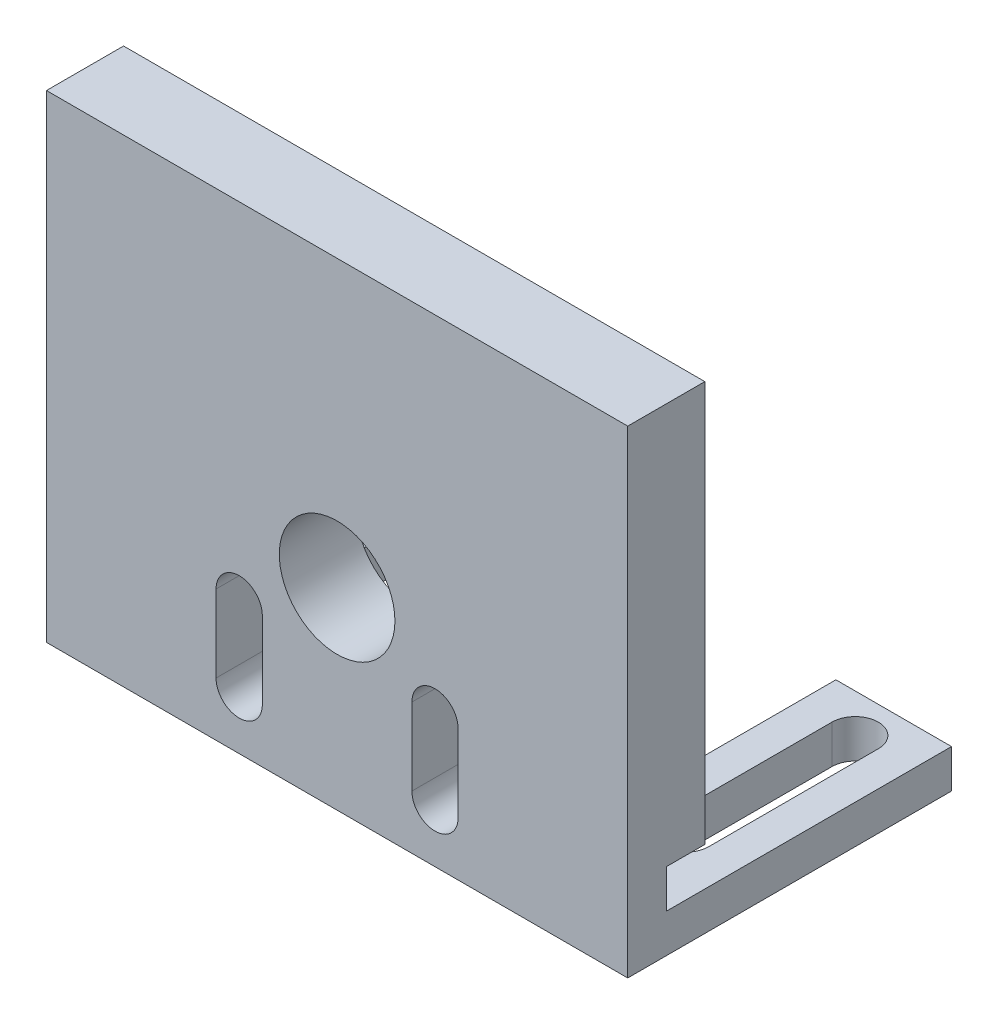
ISO-10303-21;
HEADER;
FILE_DESCRIPTION(('STEP AP214'),'2;1');
FILE_NAME('part.step','',(''),(''),'','','');
FILE_SCHEMA(('AUTOMOTIVE_DESIGN { 1 0 10303 214 1 1 1 1 }'));
ENDSEC;
DATA;
#1=APPLICATION_CONTEXT('core data for automotive mechanical design processes');
#2=APPLICATION_PROTOCOL_DEFINITION('international standard','automotive_design',2000,#1);
#3=PRODUCT_CONTEXT('',#1,'mechanical');
#4=PRODUCT('Part','Part','',(#3));
#5=PRODUCT_RELATED_PRODUCT_CATEGORY('part','',(#4));
#6=PRODUCT_DEFINITION_FORMATION('','',#4);
#7=PRODUCT_DEFINITION_CONTEXT('part definition',#1,'design');
#8=PRODUCT_DEFINITION('design','',#6,#7);
#9=PRODUCT_DEFINITION_SHAPE('','',#8);
#10=(LENGTH_UNIT() NAMED_UNIT(*) SI_UNIT(.MILLI.,.METRE.));
#11=(NAMED_UNIT(*) PLANE_ANGLE_UNIT() SI_UNIT($,.RADIAN.));
#12=(NAMED_UNIT(*) SI_UNIT($,.STERADIAN.) SOLID_ANGLE_UNIT());
#13=UNCERTAINTY_MEASURE_WITH_UNIT(LENGTH_MEASURE(1.E-05),#10,'distance_accuracy_value','');
#14=(GEOMETRIC_REPRESENTATION_CONTEXT(3) GLOBAL_UNCERTAINTY_ASSIGNED_CONTEXT((#13)) GLOBAL_UNIT_ASSIGNED_CONTEXT((#10,
#11,#12)) REPRESENTATION_CONTEXT('',''));
#15=CARTESIAN_POINT('',(0.,0.,0.));
#16=DIRECTION('',(0.,0.,1.));
#17=DIRECTION('',(1.,0.,0.));
#18=AXIS2_PLACEMENT_3D('',#15,#16,#17);
#19=CARTESIAN_POINT('',(0.,0.,0.));
#20=DIRECTION('',(0.,0.,-1.));
#21=DIRECTION('',(-1.,0.,0.));
#22=AXIS2_PLACEMENT_3D('',#19,#20,#21);
#23=PLANE('',#22);
#24=DIRECTION('',(0.,1.,0.));
#25=VECTOR('',#24,1.);
#26=CARTESIAN_POINT('',(15.7,17.,0.));
#27=LINE('',#26,#25);
#28=CARTESIAN_POINT('',(15.7,7.,0.));
#29=VERTEX_POINT('',#28);
#30=CARTESIAN_POINT('',(15.7,17.,0.));
#31=VERTEX_POINT('',#30);
#32=EDGE_CURVE('E468',#29,#31,#27,.T.);
#33=ORIENTED_EDGE('',*,*,#32,.T.);
#34=CARTESIAN_POINT('',(12.7,17.,0.));
#35=DIRECTION('',(0.,0.,1.));
#36=DIRECTION('',(-1.,0.,0.));
#37=AXIS2_PLACEMENT_3D('',#34,#35,#36);
#38=CIRCLE('',#37,3.);
#39=CARTESIAN_POINT('',(9.7,17.,0.));
#40=VERTEX_POINT('',#39);
#41=EDGE_CURVE('E460',#31,#40,#38,.T.);
#42=ORIENTED_EDGE('',*,*,#41,.T.);
#43=DIRECTION('',(0.,-1.,0.));
#44=VECTOR('',#43,1.);
#45=CARTESIAN_POINT('',(9.7,17.,0.));
#46=LINE('',#45,#44);
#47=CARTESIAN_POINT('',(9.7,7.,0.));
#48=VERTEX_POINT('',#47);
#49=EDGE_CURVE('E481',#40,#48,#46,.T.);
#50=ORIENTED_EDGE('',*,*,#49,.T.);
#51=CARTESIAN_POINT('',(12.7,7.,0.));
#52=DIRECTION('',(0.,0.,1.));
#53=DIRECTION('',(-1.,0.,0.));
#54=AXIS2_PLACEMENT_3D('',#51,#52,#53);
#55=CIRCLE('',#54,3.);
#56=EDGE_CURVE('E485',#48,#29,#55,.T.);
#57=ORIENTED_EDGE('',*,*,#56,.T.);
#58=EDGE_LOOP('',(#33,#42,#50,#57));
#59=FACE_BOUND('',#58,.T.);
#60=DIRECTION('',(0.,1.,0.));
#61=VECTOR('',#60,1.);
#62=CARTESIAN_POINT('',(-9.7,17.,0.));
#63=LINE('',#62,#61);
#64=CARTESIAN_POINT('',(-9.7,7.,0.));
#65=VERTEX_POINT('',#64);
#66=CARTESIAN_POINT('',(-9.7,17.,0.));
#67=VERTEX_POINT('',#66);
#68=EDGE_CURVE('E509',#65,#67,#63,.T.);
#69=ORIENTED_EDGE('',*,*,#68,.T.);
#70=CARTESIAN_POINT('',(-12.7,17.,0.));
#71=DIRECTION('',(0.,0.,1.));
#72=DIRECTION('',(1.,0.,0.));
#73=AXIS2_PLACEMENT_3D('',#70,#71,#72);
#74=CIRCLE('',#73,3.);
#75=CARTESIAN_POINT('',(-15.7,17.,0.));
#76=VERTEX_POINT('',#75);
#77=EDGE_CURVE('E504',#67,#76,#74,.T.);
#78=ORIENTED_EDGE('',*,*,#77,.T.);
#79=DIRECTION('',(0.,-1.,0.));
#80=VECTOR('',#79,1.);
#81=CARTESIAN_POINT('',(-15.7,17.,0.));
#82=LINE('',#81,#80);
#83=CARTESIAN_POINT('',(-15.7,6.99999999999999,0.));
#84=VERTEX_POINT('',#83);
#85=EDGE_CURVE('E523',#76,#84,#82,.T.);
#86=ORIENTED_EDGE('',*,*,#85,.T.);
#87=CARTESIAN_POINT('',(-12.7,7.,0.));
#88=DIRECTION('',(0.,0.,1.));
#89=DIRECTION('',(1.,0.,0.));
#90=AXIS2_PLACEMENT_3D('',#87,#88,#89);
#91=CIRCLE('',#90,3.);
#92=EDGE_CURVE('E527',#84,#65,#91,.T.);
#93=ORIENTED_EDGE('',*,*,#92,.T.);
#94=EDGE_LOOP('',(#69,#78,#86,#93));
#95=FACE_BOUND('',#94,.T.);
#96=CARTESIAN_POINT('',(0.,25.,0.));
#97=DIRECTION('',(0.,0.,1.));
#98=DIRECTION('',(1.,0.,0.));
#99=AXIS2_PLACEMENT_3D('',#96,#97,#98);
#100=CIRCLE('',#99,7.5);
#101=CARTESIAN_POINT('',(7.5,25.,0.));
#102=VERTEX_POINT('',#101);
#103=EDGE_CURVE('E455',#102,#102,#100,.T.);
#104=ORIENTED_EDGE('',*,*,#103,.T.);
#105=EDGE_LOOP('',(#104));
#106=FACE_BOUND('',#105,.T.);
#107=DIRECTION('',(0.,-1.,0.));
#108=VECTOR('',#107,1.);
#109=CARTESIAN_POINT('',(-22.7,5.,0.));
#110=LINE('',#109,#108);
#111=CARTESIAN_POINT('',(-22.7,5.,0.));
#112=VERTEX_POINT('',#111);
#113=CARTESIAN_POINT('',(-22.7,0.,0.));
#114=VERTEX_POINT('',#113);
#115=EDGE_CURVE('E452',#112,#114,#110,.T.);
#116=ORIENTED_EDGE('',*,*,#115,.F.);
#117=DIRECTION('',(0.,1.,0.));
#118=VECTOR('',#117,1.);
#119=CARTESIAN_POINT('',(-22.7,0.,0.));
#120=LINE('',#119,#118);
#121=CARTESIAN_POINT('',(-22.7,10.,0.));
#122=VERTEX_POINT('',#121);
#123=EDGE_CURVE('E274',#112,#122,#120,.T.);
#124=ORIENTED_EDGE('',*,*,#123,.T.);
#125=DIRECTION('',(1.,0.,0.));
#126=VECTOR('',#125,1.);
#127=CARTESIAN_POINT('',(0.,10.,0.));
#128=LINE('',#127,#126);
#129=CARTESIAN_POINT('',(-37.7,10.,0.));
#130=VERTEX_POINT('',#129);
#131=EDGE_CURVE('E270',#130,#122,#128,.T.);
#132=ORIENTED_EDGE('',*,*,#131,.F.);
#133=DIRECTION('',(0.,-1.,0.));
#134=VECTOR('',#133,1.);
#135=CARTESIAN_POINT('',(-37.7,0.,0.));
#136=LINE('',#135,#134);
#137=CARTESIAN_POINT('',(-37.7,62.,0.));
#138=VERTEX_POINT('',#137);
#139=EDGE_CURVE('E547',#138,#130,#136,.T.);
#140=ORIENTED_EDGE('',*,*,#139,.F.);
#141=DIRECTION('',(-1.,0.,0.));
#142=VECTOR('',#141,1.);
#143=CARTESIAN_POINT('',(-37.7,62.,0.));
#144=LINE('',#143,#142);
#145=CARTESIAN_POINT('',(37.7,62.,0.));
#146=VERTEX_POINT('',#145);
#147=EDGE_CURVE('E553',#146,#138,#144,.T.);
#148=ORIENTED_EDGE('',*,*,#147,.F.);
#149=DIRECTION('',(0.,1.,0.));
#150=VECTOR('',#149,1.);
#151=CARTESIAN_POINT('',(37.7,0.,0.));
#152=LINE('',#151,#150);
#153=CARTESIAN_POINT('',(37.7,10.,0.));
#154=VERTEX_POINT('',#153);
#155=EDGE_CURVE('E568',#154,#146,#152,.T.);
#156=ORIENTED_EDGE('',*,*,#155,.F.);
#157=DIRECTION('',(-1.,0.,0.));
#158=VECTOR('',#157,1.);
#159=CARTESIAN_POINT('',(0.,10.,0.));
#160=LINE('',#159,#158);
#161=CARTESIAN_POINT('',(22.7,10.,0.));
#162=VERTEX_POINT('',#161);
#163=EDGE_CURVE('E305',#154,#162,#160,.T.);
#164=ORIENTED_EDGE('',*,*,#163,.T.);
#165=DIRECTION('',(0.,1.,0.));
#166=VECTOR('',#165,1.);
#167=CARTESIAN_POINT('',(22.7,0.,0.));
#168=LINE('',#167,#166);
#169=CARTESIAN_POINT('',(22.7,5.,0.));
#170=VERTEX_POINT('',#169);
#171=EDGE_CURVE('E293',#170,#162,#168,.T.);
#172=ORIENTED_EDGE('',*,*,#171,.F.);
#173=DIRECTION('',(0.,-1.,0.));
#174=VECTOR('',#173,1.);
#175=CARTESIAN_POINT('',(22.7,5.,0.));
#176=LINE('',#175,#174);
#177=CARTESIAN_POINT('',(22.7,0.,0.));
#178=VERTEX_POINT('',#177);
#179=EDGE_CURVE('E324',#170,#178,#176,.T.);
#180=ORIENTED_EDGE('',*,*,#179,.T.);
#181=DIRECTION('',(1.,0.,0.));
#182=VECTOR('',#181,1.);
#183=CARTESIAN_POINT('',(-37.7,0.,0.));
#184=LINE('',#183,#182);
#185=EDGE_CURVE('E61',#114,#178,#184,.T.);
#186=ORIENTED_EDGE('',*,*,#185,.F.);
#187=EDGE_LOOP('',(#116,#124,#132,#140,#148,#156,#164,#172,#180,#186));
#188=FACE_BOUND('',#187,.T.);
#189=ADVANCED_FACE('F45',(#59,#95,#106,#188),#23,.T.);
#190=CARTESIAN_POINT('',(-37.7,0.,10.));
#191=DIRECTION('',(1.,0.,0.));
#192=DIRECTION('',(0.,1.,0.));
#193=AXIS2_PLACEMENT_3D('',#190,#191,#192);
#194=PLANE('',#193);
#195=DIRECTION('',(0.,1.,0.));
#196=VECTOR('',#195,1.);
#197=CARTESIAN_POINT('',(-37.7,0.,5.));
#198=LINE('',#197,#196);
#199=CARTESIAN_POINT('',(-37.7,5.,5.));
#200=VERTEX_POINT('',#199);
#201=CARTESIAN_POINT('',(-37.7,10.,5.));
#202=VERTEX_POINT('',#201);
#203=EDGE_CURVE('E970',#200,#202,#198,.T.);
#204=ORIENTED_EDGE('',*,*,#203,.F.);
#205=DIRECTION('',(0.,0.,1.));
#206=VECTOR('',#205,1.);
#207=CARTESIAN_POINT('',(-37.7,5.,0.));
#208=LINE('',#207,#206);
#209=CARTESIAN_POINT('',(-37.7,5.,-32.));
#210=VERTEX_POINT('',#209);
#211=EDGE_CURVE('E268',#210,#200,#208,.T.);
#212=ORIENTED_EDGE('',*,*,#211,.F.);
#213=DIRECTION('',(0.,-1.,0.));
#214=VECTOR('',#213,1.);
#215=CARTESIAN_POINT('',(-37.7,5.,-32.));
#216=LINE('',#215,#214);
#217=CARTESIAN_POINT('',(-37.7,0.,-32.));
#218=VERTEX_POINT('',#217);
#219=EDGE_CURVE('E439',#210,#218,#216,.T.);
#220=ORIENTED_EDGE('',*,*,#219,.T.);
#221=DIRECTION('',(0.,0.,-1.));
#222=VECTOR('',#221,1.);
#223=CARTESIAN_POINT('',(-37.7,0.,10.));
#224=LINE('',#223,#222);
#225=CARTESIAN_POINT('',(-37.7,0.,10.));
#226=VERTEX_POINT('',#225);
#227=EDGE_CURVE('E11',#226,#218,#224,.T.);
#228=ORIENTED_EDGE('',*,*,#227,.F.);
#229=DIRECTION('',(0.,-1.,0.));
#230=VECTOR('',#229,1.);
#231=CARTESIAN_POINT('',(-37.7,0.,10.));
#232=LINE('',#231,#230);
#233=CARTESIAN_POINT('',(-37.7,62.,10.));
#234=VERTEX_POINT('',#233);
#235=EDGE_CURVE('E548',#234,#226,#232,.T.);
#236=ORIENTED_EDGE('',*,*,#235,.F.);
#237=DIRECTION('',(0.,0.,-1.));
#238=VECTOR('',#237,1.);
#239=CARTESIAN_POINT('',(-37.7,62.,10.));
#240=LINE('',#239,#238);
#241=EDGE_CURVE('E562',#234,#138,#240,.T.);
#242=ORIENTED_EDGE('',*,*,#241,.T.);
#243=ORIENTED_EDGE('',*,*,#139,.T.);
#244=DIRECTION('',(0.,0.,-1.));
#245=VECTOR('',#244,1.);
#246=CARTESIAN_POINT('',(-37.7,10.,5.));
#247=LINE('',#246,#245);
#248=EDGE_CURVE('E284',#202,#130,#247,.T.);
#249=ORIENTED_EDGE('',*,*,#248,.F.);
#250=EDGE_LOOP('',(#204,#212,#220,#228,#236,#242,#243,#249));
#251=FACE_BOUND('',#250,.T.);
#252=ADVANCED_FACE('F47',(#251),#194,.F.);
#253=CARTESIAN_POINT('',(0.,0.,10.));
#254=DIRECTION('',(0.,0.,-1.));
#255=DIRECTION('',(-1.,0.,0.));
#256=AXIS2_PLACEMENT_3D('',#253,#254,#255);
#257=PLANE('',#256);
#258=CARTESIAN_POINT('',(-12.7,17.,10.));
#259=DIRECTION('',(0.,0.,1.));
#260=DIRECTION('',(1.,0.,0.));
#261=AXIS2_PLACEMENT_3D('',#258,#259,#260);
#262=CIRCLE('',#261,3.);
#263=CARTESIAN_POINT('',(-9.7,17.,10.));
#264=VERTEX_POINT('',#263);
#265=CARTESIAN_POINT('',(-15.7,17.,10.));
#266=VERTEX_POINT('',#265);
#267=EDGE_CURVE('E505',#264,#266,#262,.T.);
#268=ORIENTED_EDGE('',*,*,#267,.F.);
#269=DIRECTION('',(0.,1.,0.));
#270=VECTOR('',#269,1.);
#271=CARTESIAN_POINT('',(-9.7,17.,10.));
#272=LINE('',#271,#270);
#273=CARTESIAN_POINT('',(-9.7,7.,10.));
#274=VERTEX_POINT('',#273);
#275=EDGE_CURVE('E516',#274,#264,#272,.T.);
#276=ORIENTED_EDGE('',*,*,#275,.F.);
#277=CARTESIAN_POINT('',(-12.7,7.,10.));
#278=DIRECTION('',(0.,0.,1.));
#279=DIRECTION('',(1.,0.,0.));
#280=AXIS2_PLACEMENT_3D('',#277,#278,#279);
#281=CIRCLE('',#280,3.);
#282=CARTESIAN_POINT('',(-15.7,6.99999999999999,10.));
#283=VERTEX_POINT('',#282);
#284=EDGE_CURVE('E512',#283,#274,#281,.T.);
#285=ORIENTED_EDGE('',*,*,#284,.F.);
#286=DIRECTION('',(0.,-1.,0.));
#287=VECTOR('',#286,1.);
#288=CARTESIAN_POINT('',(-15.7,17.,10.));
#289=LINE('',#288,#287);
#290=EDGE_CURVE('E508',#266,#283,#289,.T.);
#291=ORIENTED_EDGE('',*,*,#290,.F.);
#292=EDGE_LOOP('',(#268,#276,#285,#291));
#293=FACE_BOUND('',#292,.T.);
#294=ORIENTED_EDGE('',*,*,#235,.T.);
#295=DIRECTION('',(1.,0.,0.));
#296=VECTOR('',#295,1.);
#297=CARTESIAN_POINT('',(-37.7,0.,10.));
#298=LINE('',#297,#296);
#299=CARTESIAN_POINT('',(37.7,0.,10.));
#300=VERTEX_POINT('',#299);
#301=EDGE_CURVE('E552',#226,#300,#298,.T.);
#302=ORIENTED_EDGE('',*,*,#301,.T.);
#303=DIRECTION('',(0.,1.,0.));
#304=VECTOR('',#303,1.);
#305=CARTESIAN_POINT('',(37.7,0.,10.));
#306=LINE('',#305,#304);
#307=CARTESIAN_POINT('',(37.7,62.,10.));
#308=VERTEX_POINT('',#307);
#309=EDGE_CURVE('E556',#300,#308,#306,.T.);
#310=ORIENTED_EDGE('',*,*,#309,.T.);
#311=DIRECTION('',(-1.,0.,0.));
#312=VECTOR('',#311,1.);
#313=CARTESIAN_POINT('',(-37.7,62.,10.));
#314=LINE('',#313,#312);
#315=EDGE_CURVE('E559',#308,#234,#314,.T.);
#316=ORIENTED_EDGE('',*,*,#315,.T.);
#317=EDGE_LOOP('',(#294,#302,#310,#316));
#318=FACE_BOUND('',#317,.T.);
#319=CARTESIAN_POINT('',(12.7,17.,10.));
#320=DIRECTION('',(0.,0.,1.));
#321=DIRECTION('',(-1.,0.,0.));
#322=AXIS2_PLACEMENT_3D('',#319,#320,#321);
#323=CIRCLE('',#322,3.);
#324=CARTESIAN_POINT('',(15.7,17.,10.));
#325=VERTEX_POINT('',#324);
#326=CARTESIAN_POINT('',(9.7,17.,10.));
#327=VERTEX_POINT('',#326);
#328=EDGE_CURVE('E464',#325,#327,#323,.T.);
#329=ORIENTED_EDGE('',*,*,#328,.F.);
#330=DIRECTION('',(0.,1.,0.));
#331=VECTOR('',#330,1.);
#332=CARTESIAN_POINT('',(15.7,17.,10.));
#333=LINE('',#332,#331);
#334=CARTESIAN_POINT('',(15.7,7.,10.));
#335=VERTEX_POINT('',#334);
#336=EDGE_CURVE('E474',#335,#325,#333,.T.);
#337=ORIENTED_EDGE('',*,*,#336,.F.);
#338=CARTESIAN_POINT('',(12.7,7.,10.));
#339=DIRECTION('',(0.,0.,1.));
#340=DIRECTION('',(-1.,0.,0.));
#341=AXIS2_PLACEMENT_3D('',#338,#339,#340);
#342=CIRCLE('',#341,3.);
#343=CARTESIAN_POINT('',(9.7,7.,10.));
#344=VERTEX_POINT('',#343);
#345=EDGE_CURVE('E471',#344,#335,#342,.T.);
#346=ORIENTED_EDGE('',*,*,#345,.F.);
#347=DIRECTION('',(0.,-1.,0.));
#348=VECTOR('',#347,1.);
#349=CARTESIAN_POINT('',(9.7,17.,10.));
#350=LINE('',#349,#348);
#351=EDGE_CURVE('E467',#327,#344,#350,.T.);
#352=ORIENTED_EDGE('',*,*,#351,.F.);
#353=EDGE_LOOP('',(#329,#337,#346,#352));
#354=FACE_BOUND('',#353,.T.);
#355=CARTESIAN_POINT('',(0.,25.,10.));
#356=DIRECTION('',(0.,0.,1.));
#357=DIRECTION('',(1.,0.,0.));
#358=AXIS2_PLACEMENT_3D('',#355,#356,#357);
#359=CIRCLE('',#358,7.5);
#360=CARTESIAN_POINT('',(7.5,25.,10.));
#361=VERTEX_POINT('',#360);
#362=EDGE_CURVE('E456',#361,#361,#359,.T.);
#363=ORIENTED_EDGE('',*,*,#362,.F.);
#364=EDGE_LOOP('',(#363));
#365=FACE_BOUND('',#364,.T.);
#366=ADVANCED_FACE('F632',(#293,#318,#354,#365),#257,.F.);
#367=CARTESIAN_POINT('',(-37.7,0.,10.));
#368=DIRECTION('',(0.,1.,0.));
#369=DIRECTION('',(-1.,0.,0.));
#370=AXIS2_PLACEMENT_3D('',#367,#368,#369);
#371=PLANE('',#370);
#372=ORIENTED_EDGE('',*,*,#227,.T.);
#373=DIRECTION('',(-1.,0.,0.));
#374=VECTOR('',#373,1.);
#375=CARTESIAN_POINT('',(-37.7,0.,-32.));
#376=LINE('',#375,#374);
#377=CARTESIAN_POINT('',(-22.7,0.,-32.));
#378=VERTEX_POINT('',#377);
#379=EDGE_CURVE('E433',#378,#218,#376,.T.);
#380=ORIENTED_EDGE('',*,*,#379,.F.);
#381=DIRECTION('',(0.,0.,-1.));
#382=VECTOR('',#381,1.);
#383=CARTESIAN_POINT('',(-22.7,0.,0.));
#384=LINE('',#383,#382);
#385=EDGE_CURVE('E429',#114,#378,#384,.T.);
#386=ORIENTED_EDGE('',*,*,#385,.F.);
#387=ORIENTED_EDGE('',*,*,#185,.T.);
#388=DIRECTION('',(0.,0.,1.));
#389=VECTOR('',#388,1.);
#390=CARTESIAN_POINT('',(22.7,0.,0.));
#391=LINE('',#390,#389);
#392=CARTESIAN_POINT('',(22.7,0.,-32.));
#393=VERTEX_POINT('',#392);
#394=EDGE_CURVE('E328',#393,#178,#391,.T.);
#395=ORIENTED_EDGE('',*,*,#394,.F.);
#396=DIRECTION('',(-1.,0.,0.));
#397=VECTOR('',#396,1.);
#398=CARTESIAN_POINT('',(37.7,0.,-32.));
#399=LINE('',#398,#397);
#400=CARTESIAN_POINT('',(37.7,0.,-32.));
#401=VERTEX_POINT('',#400);
#402=EDGE_CURVE('E331',#401,#393,#399,.T.);
#403=ORIENTED_EDGE('',*,*,#402,.F.);
#404=DIRECTION('',(0.,0.,-1.));
#405=VECTOR('',#404,1.);
#406=CARTESIAN_POINT('',(37.7,0.,10.));
#407=LINE('',#406,#405);
#408=EDGE_CURVE('E54',#300,#401,#407,.T.);
#409=ORIENTED_EDGE('',*,*,#408,.F.);
#410=ORIENTED_EDGE('',*,*,#301,.F.);
#411=EDGE_LOOP('',(#372,#380,#386,#387,#395,#403,#409,#410));
#412=FACE_BOUND('',#411,.T.);
#413=DIRECTION('',(0.,0.,-1.));
#414=VECTOR('',#413,1.);
#415=CARTESIAN_POINT('',(-27.2,0.,-27.));
#416=LINE('',#415,#414);
#417=CARTESIAN_POINT('',(-27.2,0.,-5.));
#418=VERTEX_POINT('',#417);
#419=CARTESIAN_POINT('',(-27.2,0.,-27.));
#420=VERTEX_POINT('',#419);
#421=EDGE_CURVE('E391',#418,#420,#416,.T.);
#422=ORIENTED_EDGE('',*,*,#421,.T.);
#423=CARTESIAN_POINT('',(-30.2,0.,-27.));
#424=DIRECTION('',(0.,1.,0.));
#425=DIRECTION('',(0.,0.,1.));
#426=AXIS2_PLACEMENT_3D('',#423,#424,#425);
#427=CIRCLE('',#426,2.99999999999999);
#428=CARTESIAN_POINT('',(-33.2,0.,-27.));
#429=VERTEX_POINT('',#428);
#430=EDGE_CURVE('E375',#420,#429,#427,.T.);
#431=ORIENTED_EDGE('',*,*,#430,.T.);
#432=DIRECTION('',(0.,0.,1.));
#433=VECTOR('',#432,1.);
#434=CARTESIAN_POINT('',(-33.2,0.,-27.));
#435=LINE('',#434,#433);
#436=CARTESIAN_POINT('',(-33.2,0.,-5.));
#437=VERTEX_POINT('',#436);
#438=EDGE_CURVE('E405',#429,#437,#435,.T.);
#439=ORIENTED_EDGE('',*,*,#438,.T.);
#440=CARTESIAN_POINT('',(-30.2,0.,-5.));
#441=DIRECTION('',(0.,1.,0.));
#442=DIRECTION('',(0.,0.,1.));
#443=AXIS2_PLACEMENT_3D('',#440,#441,#442);
#444=CIRCLE('',#443,3.);
#445=EDGE_CURVE('E409',#437,#418,#444,.T.);
#446=ORIENTED_EDGE('',*,*,#445,.T.);
#447=EDGE_LOOP('',(#422,#431,#439,#446));
#448=FACE_BOUND('',#447,.T.);
#449=DIRECTION('',(0.,0.,-1.));
#450=VECTOR('',#449,1.);
#451=CARTESIAN_POINT('',(33.2,0.,-27.));
#452=LINE('',#451,#450);
#453=CARTESIAN_POINT('',(33.2,0.,-5.));
#454=VERTEX_POINT('',#453);
#455=CARTESIAN_POINT('',(33.2,0.,-27.));
#456=VERTEX_POINT('',#455);
#457=EDGE_CURVE('E358',#454,#456,#452,.T.);
#458=ORIENTED_EDGE('',*,*,#457,.T.);
#459=CARTESIAN_POINT('',(30.2,0.,-27.));
#460=DIRECTION('',(0.,1.,0.));
#461=DIRECTION('',(0.,0.,-1.));
#462=AXIS2_PLACEMENT_3D('',#459,#460,#461);
#463=CIRCLE('',#462,3.);
#464=CARTESIAN_POINT('',(27.2,0.,-27.));
#465=VERTEX_POINT('',#464);
#466=EDGE_CURVE('E371',#456,#465,#463,.T.);
#467=ORIENTED_EDGE('',*,*,#466,.T.);
#468=DIRECTION('',(0.,0.,1.));
#469=VECTOR('',#468,1.);
#470=CARTESIAN_POINT('',(27.2,0.,-27.));
#471=LINE('',#470,#469);
#472=CARTESIAN_POINT('',(27.2,0.,-5.));
#473=VERTEX_POINT('',#472);
#474=EDGE_CURVE('E367',#465,#473,#471,.T.);
#475=ORIENTED_EDGE('',*,*,#474,.T.);
#476=CARTESIAN_POINT('',(30.2,0.,-5.));
#477=DIRECTION('',(0.,1.,0.));
#478=DIRECTION('',(0.,0.,-1.));
#479=AXIS2_PLACEMENT_3D('',#476,#477,#478);
#480=CIRCLE('',#479,3.);
#481=EDGE_CURVE('E362',#473,#454,#480,.T.);
#482=ORIENTED_EDGE('',*,*,#481,.T.);
#483=EDGE_LOOP('',(#458,#467,#475,#482));
#484=FACE_BOUND('',#483,.T.);
#485=ADVANCED_FACE('F593',(#412,#448,#484),#371,.F.);
#486=CARTESIAN_POINT('',(37.7,0.,10.));
#487=DIRECTION('',(-1.,0.,0.));
#488=DIRECTION('',(0.,-1.,0.));
#489=AXIS2_PLACEMENT_3D('',#486,#487,#488);
#490=PLANE('',#489);
#491=DIRECTION('',(0.,0.,-1.));
#492=VECTOR('',#491,1.);
#493=CARTESIAN_POINT('',(37.7,5.,0.));
#494=LINE('',#493,#492);
#495=CARTESIAN_POINT('',(37.7,5.,5.));
#496=VERTEX_POINT('',#495);
#497=CARTESIAN_POINT('',(37.7,5.,-32.));
#498=VERTEX_POINT('',#497);
#499=EDGE_CURVE('E332',#496,#498,#494,.T.);
#500=ORIENTED_EDGE('',*,*,#499,.F.);
#501=DIRECTION('',(0.,1.,0.));
#502=VECTOR('',#501,1.);
#503=CARTESIAN_POINT('',(37.7,0.,5.));
#504=LINE('',#503,#502);
#505=CARTESIAN_POINT('',(37.7,10.,5.));
#506=VERTEX_POINT('',#505);
#507=EDGE_CURVE('E292',#496,#506,#504,.T.);
#508=ORIENTED_EDGE('',*,*,#507,.T.);
#509=DIRECTION('',(0.,0.,-1.));
#510=VECTOR('',#509,1.);
#511=CARTESIAN_POINT('',(37.7,10.,5.));
#512=LINE('',#511,#510);
#513=EDGE_CURVE('E317',#506,#154,#512,.T.);
#514=ORIENTED_EDGE('',*,*,#513,.T.);
#515=ORIENTED_EDGE('',*,*,#155,.T.);
#516=DIRECTION('',(0.,0.,-1.));
#517=VECTOR('',#516,1.);
#518=CARTESIAN_POINT('',(37.7,62.,10.));
#519=LINE('',#518,#517);
#520=EDGE_CURVE('E576',#308,#146,#519,.T.);
#521=ORIENTED_EDGE('',*,*,#520,.F.);
#522=ORIENTED_EDGE('',*,*,#309,.F.);
#523=ORIENTED_EDGE('',*,*,#408,.T.);
#524=DIRECTION('',(0.,-1.,0.));
#525=VECTOR('',#524,1.);
#526=CARTESIAN_POINT('',(37.7,5.,-32.));
#527=LINE('',#526,#525);
#528=EDGE_CURVE('E276',#498,#401,#527,.T.);
#529=ORIENTED_EDGE('',*,*,#528,.F.);
#530=EDGE_LOOP('',(#500,#508,#514,#515,#521,#522,#523,#529));
#531=FACE_BOUND('',#530,.T.);
#532=ADVANCED_FACE('F584',(#531),#490,.F.);
#533=CARTESIAN_POINT('',(-37.7,62.,10.));
#534=DIRECTION('',(0.,-1.,0.));
#535=DIRECTION('',(1.,0.,0.));
#536=AXIS2_PLACEMENT_3D('',#533,#534,#535);
#537=PLANE('',#536);
#538=ORIENTED_EDGE('',*,*,#147,.T.);
#539=ORIENTED_EDGE('',*,*,#241,.F.);
#540=ORIENTED_EDGE('',*,*,#315,.F.);
#541=ORIENTED_EDGE('',*,*,#520,.T.);
#542=EDGE_LOOP('',(#538,#539,#540,#541));
#543=FACE_BOUND('',#542,.T.);
#544=ADVANCED_FACE('F638',(#543),#537,.F.);
#545=CARTESIAN_POINT('',(-12.7,17.,10.));
#546=DIRECTION('',(0.,0.,-1.));
#547=DIRECTION('',(-1.,0.,0.));
#548=AXIS2_PLACEMENT_3D('',#545,#546,#547);
#549=CYLINDRICAL_SURFACE('',#548,3.);
#550=ORIENTED_EDGE('',*,*,#77,.F.);
#551=DIRECTION('',(0.,0.,-1.));
#552=VECTOR('',#551,1.);
#553=CARTESIAN_POINT('',(-9.7,17.,10.));
#554=LINE('',#553,#552);
#555=EDGE_CURVE('E519',#264,#67,#554,.T.);
#556=ORIENTED_EDGE('',*,*,#555,.F.);
#557=ORIENTED_EDGE('',*,*,#267,.T.);
#558=DIRECTION('',(0.,0.,-1.));
#559=VECTOR('',#558,1.);
#560=CARTESIAN_POINT('',(-15.7,17.,10.));
#561=LINE('',#560,#559);
#562=EDGE_CURVE('E543',#266,#76,#561,.T.);
#563=ORIENTED_EDGE('',*,*,#562,.T.);
#564=EDGE_LOOP('',(#550,#556,#557,#563));
#565=FACE_BOUND('',#564,.T.);
#566=ADVANCED_FACE('F641',(#565),#549,.F.);
#567=CARTESIAN_POINT('',(-15.7,17.,10.));
#568=DIRECTION('',(1.,0.,0.));
#569=DIRECTION('',(0.,0.,-1.));
#570=AXIS2_PLACEMENT_3D('',#567,#568,#569);
#571=PLANE('',#570);
#572=ORIENTED_EDGE('',*,*,#85,.F.);
#573=ORIENTED_EDGE('',*,*,#562,.F.);
#574=ORIENTED_EDGE('',*,*,#290,.T.);
#575=DIRECTION('',(0.,0.,-1.));
#576=VECTOR('',#575,1.);
#577=CARTESIAN_POINT('',(-15.7,6.99999999999999,10.));
#578=LINE('',#577,#576);
#579=EDGE_CURVE('E540',#283,#84,#578,.T.);
#580=ORIENTED_EDGE('',*,*,#579,.T.);
#581=EDGE_LOOP('',(#572,#573,#574,#580));
#582=FACE_BOUND('',#581,.T.);
#583=ADVANCED_FACE('F701',(#582),#571,.T.);
#584=CARTESIAN_POINT('',(-12.7,7.,10.));
#585=DIRECTION('',(0.,0.,-1.));
#586=DIRECTION('',(-1.,0.,0.));
#587=AXIS2_PLACEMENT_3D('',#584,#585,#586);
#588=CYLINDRICAL_SURFACE('',#587,3.);
#589=ORIENTED_EDGE('',*,*,#92,.F.);
#590=ORIENTED_EDGE('',*,*,#579,.F.);
#591=ORIENTED_EDGE('',*,*,#284,.T.);
#592=DIRECTION('',(0.,0.,-1.));
#593=VECTOR('',#592,1.);
#594=CARTESIAN_POINT('',(-9.7,7.,10.));
#595=LINE('',#594,#593);
#596=EDGE_CURVE('E537',#274,#65,#595,.T.);
#597=ORIENTED_EDGE('',*,*,#596,.T.);
#598=EDGE_LOOP('',(#589,#590,#591,#597));
#599=FACE_BOUND('',#598,.T.);
#600=ADVANCED_FACE('F697',(#599),#588,.F.);
#601=CARTESIAN_POINT('',(-9.7,17.,10.));
#602=DIRECTION('',(-1.,0.,0.));
#603=DIRECTION('',(0.,0.,1.));
#604=AXIS2_PLACEMENT_3D('',#601,#602,#603);
#605=PLANE('',#604);
#606=ORIENTED_EDGE('',*,*,#68,.F.);
#607=ORIENTED_EDGE('',*,*,#596,.F.);
#608=ORIENTED_EDGE('',*,*,#275,.T.);
#609=ORIENTED_EDGE('',*,*,#555,.T.);
#610=EDGE_LOOP('',(#606,#607,#608,#609));
#611=FACE_BOUND('',#610,.T.);
#612=ADVANCED_FACE('F693',(#611),#605,.T.);
#613=CARTESIAN_POINT('',(12.7,17.,10.));
#614=DIRECTION('',(0.,0.,-1.));
#615=DIRECTION('',(-1.,0.,0.));
#616=AXIS2_PLACEMENT_3D('',#613,#614,#615);
#617=CYLINDRICAL_SURFACE('',#616,3.);
#618=ORIENTED_EDGE('',*,*,#41,.F.);
#619=DIRECTION('',(0.,0.,-1.));
#620=VECTOR('',#619,1.);
#621=CARTESIAN_POINT('',(15.7,17.,10.));
#622=LINE('',#621,#620);
#623=EDGE_CURVE('E477',#325,#31,#622,.T.);
#624=ORIENTED_EDGE('',*,*,#623,.F.);
#625=ORIENTED_EDGE('',*,*,#328,.T.);
#626=DIRECTION('',(0.,0.,-1.));
#627=VECTOR('',#626,1.);
#628=CARTESIAN_POINT('',(9.7,17.,10.));
#629=LINE('',#628,#627);
#630=EDGE_CURVE('E500',#327,#40,#629,.T.);
#631=ORIENTED_EDGE('',*,*,#630,.T.);
#632=EDGE_LOOP('',(#618,#624,#625,#631));
#633=FACE_BOUND('',#632,.T.);
#634=ADVANCED_FACE('F689',(#633),#617,.F.);
#635=CARTESIAN_POINT('',(9.7,17.,10.));
#636=DIRECTION('',(1.,0.,0.));
#637=DIRECTION('',(0.,0.,-1.));
#638=AXIS2_PLACEMENT_3D('',#635,#636,#637);
#639=PLANE('',#638);
#640=ORIENTED_EDGE('',*,*,#49,.F.);
#641=ORIENTED_EDGE('',*,*,#630,.F.);
#642=ORIENTED_EDGE('',*,*,#351,.T.);
#643=DIRECTION('',(0.,0.,-1.));
#644=VECTOR('',#643,1.);
#645=CARTESIAN_POINT('',(9.7,7.,10.));
#646=LINE('',#645,#644);
#647=EDGE_CURVE('E497',#344,#48,#646,.T.);
#648=ORIENTED_EDGE('',*,*,#647,.T.);
#649=EDGE_LOOP('',(#640,#641,#642,#648));
#650=FACE_BOUND('',#649,.T.);
#651=ADVANCED_FACE('F685',(#650),#639,.T.);
#652=CARTESIAN_POINT('',(12.7,7.,10.));
#653=DIRECTION('',(0.,0.,-1.));
#654=DIRECTION('',(-1.,0.,0.));
#655=AXIS2_PLACEMENT_3D('',#652,#653,#654);
#656=CYLINDRICAL_SURFACE('',#655,3.);
#657=ORIENTED_EDGE('',*,*,#56,.F.);
#658=ORIENTED_EDGE('',*,*,#647,.F.);
#659=ORIENTED_EDGE('',*,*,#345,.T.);
#660=DIRECTION('',(0.,0.,-1.));
#661=VECTOR('',#660,1.);
#662=CARTESIAN_POINT('',(15.7,7.,10.));
#663=LINE('',#662,#661);
#664=EDGE_CURVE('E69',#335,#29,#663,.T.);
#665=ORIENTED_EDGE('',*,*,#664,.T.);
#666=EDGE_LOOP('',(#657,#658,#659,#665));
#667=FACE_BOUND('',#666,.T.);
#668=ADVANCED_FACE('F678',(#667),#656,.F.);
#669=CARTESIAN_POINT('',(15.7,17.,10.));
#670=DIRECTION('',(-1.,0.,0.));
#671=DIRECTION('',(0.,0.,1.));
#672=AXIS2_PLACEMENT_3D('',#669,#670,#671);
#673=PLANE('',#672);
#674=ORIENTED_EDGE('',*,*,#32,.F.);
#675=ORIENTED_EDGE('',*,*,#664,.F.);
#676=ORIENTED_EDGE('',*,*,#336,.T.);
#677=ORIENTED_EDGE('',*,*,#623,.T.);
#678=EDGE_LOOP('',(#674,#675,#676,#677));
#679=FACE_BOUND('',#678,.T.);
#680=ADVANCED_FACE('F668',(#679),#673,.T.);
#681=CARTESIAN_POINT('',(0.,25.,10.));
#682=DIRECTION('',(0.,0.,-1.));
#683=DIRECTION('',(-1.,0.,0.));
#684=AXIS2_PLACEMENT_3D('',#681,#682,#683);
#685=CYLINDRICAL_SURFACE('',#684,7.5);
#686=ORIENTED_EDGE('',*,*,#362,.T.);
#687=EDGE_LOOP('',(#686));
#688=FACE_BOUND('',#687,.T.);
#689=ORIENTED_EDGE('',*,*,#103,.F.);
#690=EDGE_LOOP('',(#689));
#691=FACE_BOUND('',#690,.T.);
#692=ADVANCED_FACE('F666',(#688,#691),#685,.F.);
#693=CARTESIAN_POINT('',(0.,5.,0.));
#694=DIRECTION('',(0.,-1.,0.));
#695=DIRECTION('',(0.,0.,-1.));
#696=AXIS2_PLACEMENT_3D('',#693,#694,#695);
#697=PLANE('',#696);
#698=ORIENTED_EDGE('',*,*,#211,.T.);
#699=DIRECTION('',(1.,0.,0.));
#700=VECTOR('',#699,1.);
#701=CARTESIAN_POINT('',(0.,5.,5.));
#702=LINE('',#701,#700);
#703=CARTESIAN_POINT('',(-22.7,5.,5.));
#704=VERTEX_POINT('',#703);
#705=EDGE_CURVE('E254',#200,#704,#702,.T.);
#706=ORIENTED_EDGE('',*,*,#705,.T.);
#707=DIRECTION('',(0.,0.,-1.));
#708=VECTOR('',#707,1.);
#709=CARTESIAN_POINT('',(-22.7,5.,5.));
#710=LINE('',#709,#708);
#711=EDGE_CURVE('E265',#704,#112,#710,.T.);
#712=ORIENTED_EDGE('',*,*,#711,.T.);
#713=DIRECTION('',(0.,0.,-1.));
#714=VECTOR('',#713,1.);
#715=CARTESIAN_POINT('',(-22.7,5.,0.));
#716=LINE('',#715,#714);
#717=CARTESIAN_POINT('',(-22.7,5.,-32.));
#718=VERTEX_POINT('',#717);
#719=EDGE_CURVE('E432',#112,#718,#716,.T.);
#720=ORIENTED_EDGE('',*,*,#719,.T.);
#721=DIRECTION('',(-1.,0.,0.));
#722=VECTOR('',#721,1.);
#723=CARTESIAN_POINT('',(-37.7,5.,-32.));
#724=LINE('',#723,#722);
#725=EDGE_CURVE('E436',#718,#210,#724,.T.);
#726=ORIENTED_EDGE('',*,*,#725,.T.);
#727=EDGE_LOOP('',(#698,#706,#712,#720,#726));
#728=FACE_BOUND('',#727,.T.);
#729=CARTESIAN_POINT('',(-30.2,5.,-27.));
#730=DIRECTION('',(0.,1.,0.));
#731=DIRECTION('',(0.,0.,1.));
#732=AXIS2_PLACEMENT_3D('',#729,#730,#731);
#733=CIRCLE('',#732,2.99999999999999);
#734=CARTESIAN_POINT('',(-27.2,5.,-27.));
#735=VERTEX_POINT('',#734);
#736=CARTESIAN_POINT('',(-33.2,5.,-27.));
#737=VERTEX_POINT('',#736);
#738=EDGE_CURVE('E387',#735,#737,#733,.T.);
#739=ORIENTED_EDGE('',*,*,#738,.F.);
#740=DIRECTION('',(0.,0.,-1.));
#741=VECTOR('',#740,1.);
#742=CARTESIAN_POINT('',(-27.2,5.,-27.));
#743=LINE('',#742,#741);
#744=CARTESIAN_POINT('',(-27.2,5.,-5.));
#745=VERTEX_POINT('',#744);
#746=EDGE_CURVE('E398',#745,#735,#743,.T.);
#747=ORIENTED_EDGE('',*,*,#746,.F.);
#748=CARTESIAN_POINT('',(-30.2,5.,-5.));
#749=DIRECTION('',(0.,1.,0.));
#750=DIRECTION('',(0.,0.,1.));
#751=AXIS2_PLACEMENT_3D('',#748,#749,#750);
#752=CIRCLE('',#751,3.);
#753=CARTESIAN_POINT('',(-33.2,5.,-5.));
#754=VERTEX_POINT('',#753);
#755=EDGE_CURVE('E394',#754,#745,#752,.T.);
#756=ORIENTED_EDGE('',*,*,#755,.F.);
#757=DIRECTION('',(0.,0.,1.));
#758=VECTOR('',#757,1.);
#759=CARTESIAN_POINT('',(-33.2,5.,-27.));
#760=LINE('',#759,#758);
#761=EDGE_CURVE('E390',#737,#754,#760,.T.);
#762=ORIENTED_EDGE('',*,*,#761,.F.);
#763=EDGE_LOOP('',(#739,#747,#756,#762));
#764=FACE_BOUND('',#763,.T.);
#765=ADVANCED_FACE('F263',(#728,#764),#697,.F.);
#766=CARTESIAN_POINT('',(-22.7,5.,0.));
#767=DIRECTION('',(-1.,0.,0.));
#768=DIRECTION('',(0.,0.,1.));
#769=AXIS2_PLACEMENT_3D('',#766,#767,#768);
#770=PLANE('',#769);
#771=ORIENTED_EDGE('',*,*,#385,.T.);
#772=DIRECTION('',(0.,-1.,0.));
#773=VECTOR('',#772,1.);
#774=CARTESIAN_POINT('',(-22.7,5.,-32.));
#775=LINE('',#774,#773);
#776=EDGE_CURVE('E448',#718,#378,#775,.T.);
#777=ORIENTED_EDGE('',*,*,#776,.F.);
#778=ORIENTED_EDGE('',*,*,#719,.F.);
#779=ORIENTED_EDGE('',*,*,#115,.T.);
#780=EDGE_LOOP('',(#771,#777,#778,#779));
#781=FACE_BOUND('',#780,.T.);
#782=ADVANCED_FACE('F676',(#781),#770,.F.);
#783=CARTESIAN_POINT('',(-37.7,5.,-32.));
#784=DIRECTION('',(0.,0.,1.));
#785=DIRECTION('',(1.,0.,0.));
#786=AXIS2_PLACEMENT_3D('',#783,#784,#785);
#787=PLANE('',#786);
#788=ORIENTED_EDGE('',*,*,#379,.T.);
#789=ORIENTED_EDGE('',*,*,#219,.F.);
#790=ORIENTED_EDGE('',*,*,#725,.F.);
#791=ORIENTED_EDGE('',*,*,#776,.T.);
#792=EDGE_LOOP('',(#788,#789,#790,#791));
#793=FACE_BOUND('',#792,.T.);
#794=ADVANCED_FACE('F793',(#793),#787,.F.);
#795=CARTESIAN_POINT('',(-30.2,5.,-27.));
#796=DIRECTION('',(0.,-1.,0.));
#797=DIRECTION('',(0.,0.,-1.));
#798=AXIS2_PLACEMENT_3D('',#795,#796,#797);
#799=CYLINDRICAL_SURFACE('',#798,2.99999999999999);
#800=ORIENTED_EDGE('',*,*,#430,.F.);
#801=DIRECTION('',(0.,-1.,0.));
#802=VECTOR('',#801,1.);
#803=CARTESIAN_POINT('',(-27.2,5.,-27.));
#804=LINE('',#803,#802);
#805=EDGE_CURVE('E401',#735,#420,#804,.T.);
#806=ORIENTED_EDGE('',*,*,#805,.F.);
#807=ORIENTED_EDGE('',*,*,#738,.T.);
#808=DIRECTION('',(0.,-1.,0.));
#809=VECTOR('',#808,1.);
#810=CARTESIAN_POINT('',(-33.2,5.,-27.));
#811=LINE('',#810,#809);
#812=EDGE_CURVE('E425',#737,#429,#811,.T.);
#813=ORIENTED_EDGE('',*,*,#812,.T.);
#814=EDGE_LOOP('',(#800,#806,#807,#813));
#815=FACE_BOUND('',#814,.T.);
#816=ADVANCED_FACE('F802',(#815),#799,.F.);
#817=CARTESIAN_POINT('',(-33.2,5.,-27.));
#818=DIRECTION('',(1.,0.,0.));
#819=DIRECTION('',(0.,0.,-1.));
#820=AXIS2_PLACEMENT_3D('',#817,#818,#819);
#821=PLANE('',#820);
#822=ORIENTED_EDGE('',*,*,#438,.F.);
#823=ORIENTED_EDGE('',*,*,#812,.F.);
#824=ORIENTED_EDGE('',*,*,#761,.T.);
#825=DIRECTION('',(0.,-1.,0.));
#826=VECTOR('',#825,1.);
#827=CARTESIAN_POINT('',(-33.2,5.,-5.));
#828=LINE('',#827,#826);
#829=EDGE_CURVE('E422',#754,#437,#828,.T.);
#830=ORIENTED_EDGE('',*,*,#829,.T.);
#831=EDGE_LOOP('',(#822,#823,#824,#830));
#832=FACE_BOUND('',#831,.T.);
#833=ADVANCED_FACE('F811',(#832),#821,.T.);
#834=CARTESIAN_POINT('',(-30.2,5.,-5.));
#835=DIRECTION('',(0.,-1.,0.));
#836=DIRECTION('',(0.,0.,-1.));
#837=AXIS2_PLACEMENT_3D('',#834,#835,#836);
#838=CYLINDRICAL_SURFACE('',#837,3.);
#839=ORIENTED_EDGE('',*,*,#445,.F.);
#840=ORIENTED_EDGE('',*,*,#829,.F.);
#841=ORIENTED_EDGE('',*,*,#755,.T.);
#842=DIRECTION('',(0.,-1.,0.));
#843=VECTOR('',#842,1.);
#844=CARTESIAN_POINT('',(-27.2,5.,-5.));
#845=LINE('',#844,#843);
#846=EDGE_CURVE('E419',#745,#418,#845,.T.);
#847=ORIENTED_EDGE('',*,*,#846,.T.);
#848=EDGE_LOOP('',(#839,#840,#841,#847));
#849=FACE_BOUND('',#848,.T.);
#850=ADVANCED_FACE('F821',(#849),#838,.F.);
#851=CARTESIAN_POINT('',(-27.2,5.,-27.));
#852=DIRECTION('',(-1.,0.,0.));
#853=DIRECTION('',(0.,0.,1.));
#854=AXIS2_PLACEMENT_3D('',#851,#852,#853);
#855=PLANE('',#854);
#856=ORIENTED_EDGE('',*,*,#421,.F.);
#857=ORIENTED_EDGE('',*,*,#846,.F.);
#858=ORIENTED_EDGE('',*,*,#746,.T.);
#859=ORIENTED_EDGE('',*,*,#805,.T.);
#860=EDGE_LOOP('',(#856,#857,#858,#859));
#861=FACE_BOUND('',#860,.T.);
#862=ADVANCED_FACE('F831',(#861),#855,.T.);
#863=CARTESIAN_POINT('',(0.,5.,0.));
#864=DIRECTION('',(0.,-1.,0.));
#865=DIRECTION('',(0.,0.,-1.));
#866=AXIS2_PLACEMENT_3D('',#863,#864,#865);
#867=PLANE('',#866);
#868=DIRECTION('',(0.,0.,1.));
#869=VECTOR('',#868,1.);
#870=CARTESIAN_POINT('',(22.7,5.,0.));
#871=LINE('',#870,#869);
#872=CARTESIAN_POINT('',(22.7,5.,-32.));
#873=VERTEX_POINT('',#872);
#874=EDGE_CURVE('E327',#873,#170,#871,.T.);
#875=ORIENTED_EDGE('',*,*,#874,.T.);
#876=DIRECTION('',(0.,0.,-1.));
#877=VECTOR('',#876,1.);
#878=CARTESIAN_POINT('',(22.7,5.,5.));
#879=LINE('',#878,#877);
#880=CARTESIAN_POINT('',(22.7,5.,5.));
#881=VERTEX_POINT('',#880);
#882=EDGE_CURVE('E304',#881,#170,#879,.T.);
#883=ORIENTED_EDGE('',*,*,#882,.F.);
#884=DIRECTION('',(-1.,0.,0.));
#885=VECTOR('',#884,1.);
#886=CARTESIAN_POINT('',(0.,5.,5.));
#887=LINE('',#886,#885);
#888=EDGE_CURVE('E288',#496,#881,#887,.T.);
#889=ORIENTED_EDGE('',*,*,#888,.F.);
#890=ORIENTED_EDGE('',*,*,#499,.T.);
#891=DIRECTION('',(-1.,0.,0.));
#892=VECTOR('',#891,1.);
#893=CARTESIAN_POINT('',(37.7,5.,-32.));
#894=LINE('',#893,#892);
#895=EDGE_CURVE('E339',#498,#873,#894,.T.);
#896=ORIENTED_EDGE('',*,*,#895,.T.);
#897=EDGE_LOOP('',(#875,#883,#889,#890,#896));
#898=FACE_BOUND('',#897,.T.);
#899=CARTESIAN_POINT('',(30.2,5.,-27.));
#900=DIRECTION('',(0.,1.,0.));
#901=DIRECTION('',(0.,0.,-1.));
#902=AXIS2_PLACEMENT_3D('',#899,#900,#901);
#903=CIRCLE('',#902,3.);
#904=CARTESIAN_POINT('',(33.2,5.,-27.));
#905=VERTEX_POINT('',#904);
#906=CARTESIAN_POINT('',(27.2,5.,-27.));
#907=VERTEX_POINT('',#906);
#908=EDGE_CURVE('E363',#905,#907,#903,.T.);
#909=ORIENTED_EDGE('',*,*,#908,.F.);
#910=DIRECTION('',(0.,0.,-1.));
#911=VECTOR('',#910,1.);
#912=CARTESIAN_POINT('',(33.2,5.,-27.));
#913=LINE('',#912,#911);
#914=CARTESIAN_POINT('',(33.2,5.,-5.));
#915=VERTEX_POINT('',#914);
#916=EDGE_CURVE('E357',#915,#905,#913,.T.);
#917=ORIENTED_EDGE('',*,*,#916,.F.);
#918=CARTESIAN_POINT('',(30.2,5.,-5.));
#919=DIRECTION('',(0.,1.,0.));
#920=DIRECTION('',(0.,0.,-1.));
#921=AXIS2_PLACEMENT_3D('',#918,#919,#920);
#922=CIRCLE('',#921,3.);
#923=CARTESIAN_POINT('',(27.2,5.,-5.));
#924=VERTEX_POINT('',#923);
#925=EDGE_CURVE('E378',#924,#915,#922,.T.);
#926=ORIENTED_EDGE('',*,*,#925,.F.);
#927=DIRECTION('',(0.,0.,1.));
#928=VECTOR('',#927,1.);
#929=CARTESIAN_POINT('',(27.2,5.,-27.));
#930=LINE('',#929,#928);
#931=EDGE_CURVE('E382',#907,#924,#930,.T.);
#932=ORIENTED_EDGE('',*,*,#931,.F.);
#933=EDGE_LOOP('',(#909,#917,#926,#932));
#934=FACE_BOUND('',#933,.T.);
#935=ADVANCED_FACE('F605',(#898,#934),#867,.F.);
#936=CARTESIAN_POINT('',(37.7,5.,-32.));
#937=DIRECTION('',(0.,0.,1.));
#938=DIRECTION('',(1.,0.,0.));
#939=AXIS2_PLACEMENT_3D('',#936,#937,#938);
#940=PLANE('',#939);
#941=ORIENTED_EDGE('',*,*,#402,.T.);
#942=DIRECTION('',(0.,-1.,0.));
#943=VECTOR('',#942,1.);
#944=CARTESIAN_POINT('',(22.7,5.,-32.));
#945=LINE('',#944,#943);
#946=EDGE_CURVE('E282',#873,#393,#945,.T.);
#947=ORIENTED_EDGE('',*,*,#946,.F.);
#948=ORIENTED_EDGE('',*,*,#895,.F.);
#949=ORIENTED_EDGE('',*,*,#528,.T.);
#950=EDGE_LOOP('',(#941,#947,#948,#949));
#951=FACE_BOUND('',#950,.T.);
#952=ADVANCED_FACE('F590',(#951),#940,.F.);
#953=CARTESIAN_POINT('',(22.7,5.,0.));
#954=DIRECTION('',(1.,0.,0.));
#955=DIRECTION('',(0.,0.,-1.));
#956=AXIS2_PLACEMENT_3D('',#953,#954,#955);
#957=PLANE('',#956);
#958=ORIENTED_EDGE('',*,*,#394,.T.);
#959=ORIENTED_EDGE('',*,*,#179,.F.);
#960=ORIENTED_EDGE('',*,*,#874,.F.);
#961=ORIENTED_EDGE('',*,*,#946,.T.);
#962=EDGE_LOOP('',(#958,#959,#960,#961));
#963=FACE_BOUND('',#962,.T.);
#964=ADVANCED_FACE('F598',(#963),#957,.F.);
#965=CARTESIAN_POINT('',(30.2,5.,-27.));
#966=DIRECTION('',(0.,-1.,0.));
#967=DIRECTION('',(0.,0.,-1.));
#968=AXIS2_PLACEMENT_3D('',#965,#966,#967);
#969=CYLINDRICAL_SURFACE('',#968,3.);
#970=ORIENTED_EDGE('',*,*,#466,.F.);
#971=DIRECTION('',(0.,-1.,0.));
#972=VECTOR('',#971,1.);
#973=CARTESIAN_POINT('',(33.2,5.,-27.));
#974=LINE('',#973,#972);
#975=EDGE_CURVE('E353',#905,#456,#974,.T.);
#976=ORIENTED_EDGE('',*,*,#975,.F.);
#977=ORIENTED_EDGE('',*,*,#908,.T.);
#978=DIRECTION('',(0.,-1.,0.));
#979=VECTOR('',#978,1.);
#980=CARTESIAN_POINT('',(27.2,5.,-27.));
#981=LINE('',#980,#979);
#982=EDGE_CURVE('E335',#907,#465,#981,.T.);
#983=ORIENTED_EDGE('',*,*,#982,.T.);
#984=EDGE_LOOP('',(#970,#976,#977,#983));
#985=FACE_BOUND('',#984,.T.);
#986=ADVANCED_FACE('F869',(#985),#969,.F.);
#987=CARTESIAN_POINT('',(27.2,5.,-27.));
#988=DIRECTION('',(1.,0.,0.));
#989=DIRECTION('',(0.,0.,-1.));
#990=AXIS2_PLACEMENT_3D('',#987,#988,#989);
#991=PLANE('',#990);
#992=ORIENTED_EDGE('',*,*,#474,.F.);
#993=ORIENTED_EDGE('',*,*,#982,.F.);
#994=ORIENTED_EDGE('',*,*,#931,.T.);
#995=DIRECTION('',(0.,-1.,0.));
#996=VECTOR('',#995,1.);
#997=CARTESIAN_POINT('',(27.2,5.,-5.));
#998=LINE('',#997,#996);
#999=EDGE_CURVE('E347',#924,#473,#998,.T.);
#1000=ORIENTED_EDGE('',*,*,#999,.T.);
#1001=EDGE_LOOP('',(#992,#993,#994,#1000));
#1002=FACE_BOUND('',#1001,.T.);
#1003=ADVANCED_FACE('F877',(#1002),#991,.T.);
#1004=CARTESIAN_POINT('',(30.2,5.,-5.));
#1005=DIRECTION('',(0.,-1.,0.));
#1006=DIRECTION('',(0.,0.,-1.));
#1007=AXIS2_PLACEMENT_3D('',#1004,#1005,#1006);
#1008=CYLINDRICAL_SURFACE('',#1007,3.);
#1009=ORIENTED_EDGE('',*,*,#481,.F.);
#1010=ORIENTED_EDGE('',*,*,#999,.F.);
#1011=ORIENTED_EDGE('',*,*,#925,.T.);
#1012=DIRECTION('',(0.,-1.,0.));
#1013=VECTOR('',#1012,1.);
#1014=CARTESIAN_POINT('',(33.2,5.,-5.));
#1015=LINE('',#1014,#1013);
#1016=EDGE_CURVE('E350',#915,#454,#1015,.T.);
#1017=ORIENTED_EDGE('',*,*,#1016,.T.);
#1018=EDGE_LOOP('',(#1009,#1010,#1011,#1017));
#1019=FACE_BOUND('',#1018,.T.);
#1020=ADVANCED_FACE('F887',(#1019),#1008,.F.);
#1021=CARTESIAN_POINT('',(33.2,5.,-27.));
#1022=DIRECTION('',(-1.,0.,0.));
#1023=DIRECTION('',(0.,0.,1.));
#1024=AXIS2_PLACEMENT_3D('',#1021,#1022,#1023);
#1025=PLANE('',#1024);
#1026=ORIENTED_EDGE('',*,*,#457,.F.);
#1027=ORIENTED_EDGE('',*,*,#1016,.F.);
#1028=ORIENTED_EDGE('',*,*,#916,.T.);
#1029=ORIENTED_EDGE('',*,*,#975,.T.);
#1030=EDGE_LOOP('',(#1026,#1027,#1028,#1029));
#1031=FACE_BOUND('',#1030,.T.);
#1032=ADVANCED_FACE('F623',(#1031),#1025,.T.);
#1033=CARTESIAN_POINT('',(0.,10.,5.));
#1034=DIRECTION('',(0.,-1.,0.));
#1035=DIRECTION('',(0.,0.,-1.));
#1036=AXIS2_PLACEMENT_3D('',#1033,#1034,#1035);
#1037=PLANE('',#1036);
#1038=ORIENTED_EDGE('',*,*,#163,.F.);
#1039=ORIENTED_EDGE('',*,*,#513,.F.);
#1040=DIRECTION('',(-1.,0.,0.));
#1041=VECTOR('',#1040,1.);
#1042=CARTESIAN_POINT('',(0.,10.,5.));
#1043=LINE('',#1042,#1041);
#1044=CARTESIAN_POINT('',(22.7,10.,5.));
#1045=VERTEX_POINT('',#1044);
#1046=EDGE_CURVE('E297',#506,#1045,#1043,.T.);
#1047=ORIENTED_EDGE('',*,*,#1046,.T.);
#1048=DIRECTION('',(0.,0.,-1.));
#1049=VECTOR('',#1048,1.);
#1050=CARTESIAN_POINT('',(22.7,10.,5.));
#1051=LINE('',#1050,#1049);
#1052=EDGE_CURVE('E314',#1045,#162,#1051,.T.);
#1053=ORIENTED_EDGE('',*,*,#1052,.T.);
#1054=EDGE_LOOP('',(#1038,#1039,#1047,#1053));
#1055=FACE_BOUND('',#1054,.T.);
#1056=ADVANCED_FACE('F614',(#1055),#1037,.T.);
#1057=CARTESIAN_POINT('',(22.7,0.,5.));
#1058=DIRECTION('',(-1.,0.,0.));
#1059=DIRECTION('',(0.,0.,1.));
#1060=AXIS2_PLACEMENT_3D('',#1057,#1058,#1059);
#1061=PLANE('',#1060);
#1062=ORIENTED_EDGE('',*,*,#171,.T.);
#1063=ORIENTED_EDGE('',*,*,#1052,.F.);
#1064=DIRECTION('',(0.,1.,0.));
#1065=VECTOR('',#1064,1.);
#1066=CARTESIAN_POINT('',(22.7,0.,5.));
#1067=LINE('',#1066,#1065);
#1068=EDGE_CURVE('E300',#881,#1045,#1067,.T.);
#1069=ORIENTED_EDGE('',*,*,#1068,.F.);
#1070=ORIENTED_EDGE('',*,*,#882,.T.);
#1071=EDGE_LOOP('',(#1062,#1063,#1069,#1070));
#1072=FACE_BOUND('',#1071,.T.);
#1073=ADVANCED_FACE('F615',(#1072),#1061,.F.);
#1074=CARTESIAN_POINT('',(0.,0.,5.));
#1075=DIRECTION('',(0.,0.,1.));
#1076=DIRECTION('',(1.,0.,0.));
#1077=AXIS2_PLACEMENT_3D('',#1074,#1075,#1076);
#1078=PLANE('',#1077);
#1079=ORIENTED_EDGE('',*,*,#888,.T.);
#1080=ORIENTED_EDGE('',*,*,#1068,.T.);
#1081=ORIENTED_EDGE('',*,*,#1046,.F.);
#1082=ORIENTED_EDGE('',*,*,#507,.F.);
#1083=EDGE_LOOP('',(#1079,#1080,#1081,#1082));
#1084=FACE_BOUND('',#1083,.T.);
#1085=ADVANCED_FACE('F611',(#1084),#1078,.F.);
#1086=CARTESIAN_POINT('',(-22.7,0.,5.));
#1087=DIRECTION('',(-1.,0.,0.));
#1088=DIRECTION('',(0.,0.,1.));
#1089=AXIS2_PLACEMENT_3D('',#1086,#1087,#1088);
#1090=PLANE('',#1089);
#1091=ORIENTED_EDGE('',*,*,#123,.F.);
#1092=ORIENTED_EDGE('',*,*,#711,.F.);
#1093=DIRECTION('',(0.,1.,0.));
#1094=VECTOR('',#1093,1.);
#1095=CARTESIAN_POINT('',(-22.7,0.,5.));
#1096=LINE('',#1095,#1094);
#1097=CARTESIAN_POINT('',(-22.7,10.,5.));
#1098=VERTEX_POINT('',#1097);
#1099=EDGE_CURVE('E250',#704,#1098,#1096,.T.);
#1100=ORIENTED_EDGE('',*,*,#1099,.T.);
#1101=DIRECTION('',(0.,0.,-1.));
#1102=VECTOR('',#1101,1.);
#1103=CARTESIAN_POINT('',(-22.7,10.,5.));
#1104=LINE('',#1103,#1102);
#1105=EDGE_CURVE('E277',#1098,#122,#1104,.T.);
#1106=ORIENTED_EDGE('',*,*,#1105,.T.);
#1107=EDGE_LOOP('',(#1091,#1092,#1100,#1106));
#1108=FACE_BOUND('',#1107,.T.);
#1109=ADVANCED_FACE('F272',(#1108),#1090,.T.);
#1110=CARTESIAN_POINT('',(0.,10.,5.));
#1111=DIRECTION('',(0.,1.,0.));
#1112=DIRECTION('',(0.,0.,1.));
#1113=AXIS2_PLACEMENT_3D('',#1110,#1111,#1112);
#1114=PLANE('',#1113);
#1115=ORIENTED_EDGE('',*,*,#131,.T.);
#1116=ORIENTED_EDGE('',*,*,#1105,.F.);
#1117=DIRECTION('',(1.,0.,0.));
#1118=VECTOR('',#1117,1.);
#1119=CARTESIAN_POINT('',(0.,10.,5.));
#1120=LINE('',#1119,#1118);
#1121=EDGE_CURVE('E256',#202,#1098,#1120,.T.);
#1122=ORIENTED_EDGE('',*,*,#1121,.F.);
#1123=ORIENTED_EDGE('',*,*,#248,.T.);
#1124=EDGE_LOOP('',(#1115,#1116,#1122,#1123));
#1125=FACE_BOUND('',#1124,.T.);
#1126=ADVANCED_FACE('F938',(#1125),#1114,.F.);
#1127=CARTESIAN_POINT('',(0.,0.,5.));
#1128=DIRECTION('',(0.,0.,1.));
#1129=DIRECTION('',(1.,0.,0.));
#1130=AXIS2_PLACEMENT_3D('',#1127,#1128,#1129);
#1131=PLANE('',#1130);
#1132=ORIENTED_EDGE('',*,*,#705,.F.);
#1133=ORIENTED_EDGE('',*,*,#203,.T.);
#1134=ORIENTED_EDGE('',*,*,#1121,.T.);
#1135=ORIENTED_EDGE('',*,*,#1099,.F.);
#1136=EDGE_LOOP('',(#1132,#1133,#1134,#1135));
#1137=FACE_BOUND('',#1136,.T.);
#1138=ADVANCED_FACE('F252',(#1137),#1131,.F.);
#1139=CLOSED_SHELL('',(#189,#252,#366,#485,#532,#544,#566,#583,#600,#612,#634,#651,#668,#680,
#692,#765,#782,#794,#816,#833,#850,#862,#935,#952,#964,#986,#1003,#1020,#1032,#1056,#1073,#1085,
#1109,#1126,#1138));
#1140=MANIFOLD_SOLID_BREP('B2',#1139);
#1141=ADVANCED_BREP_SHAPE_REPRESENTATION('',(#18,#1140),#14);
#1142=SHAPE_DEFINITION_REPRESENTATION(#9,#1141);
ENDSEC;
END-ISO-10303-21;
